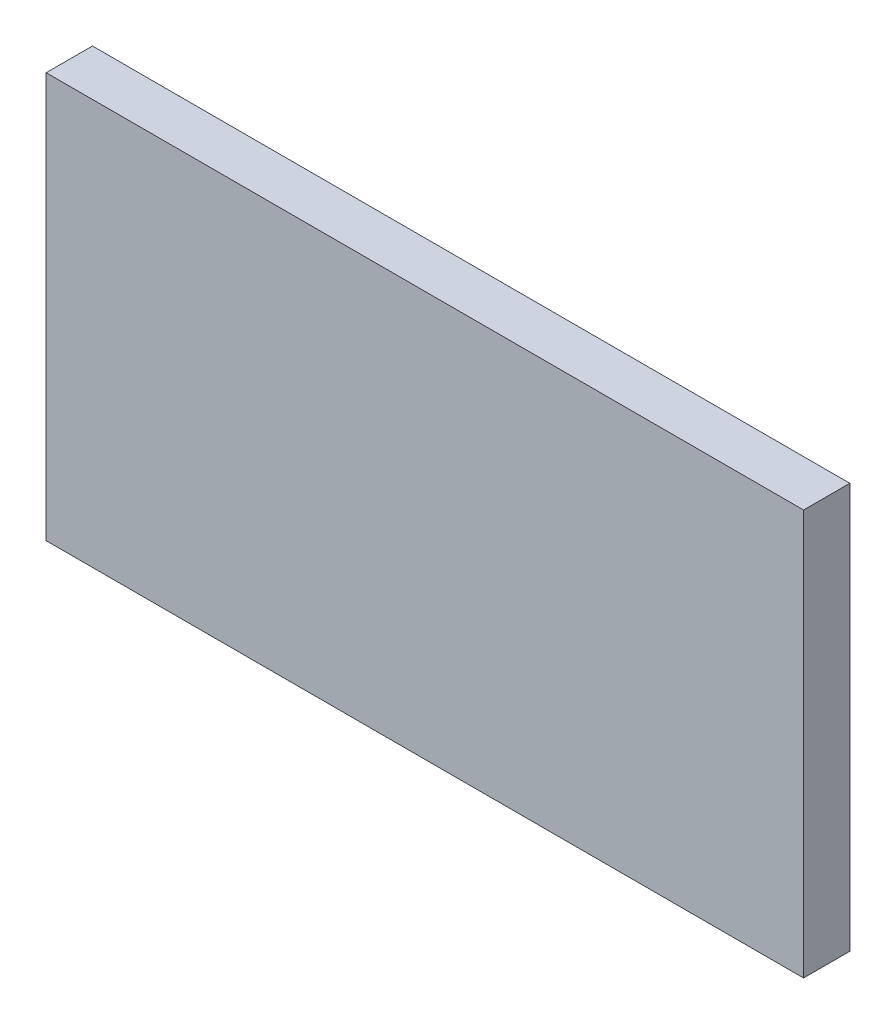
ISO-10303-21;
HEADER;
FILE_DESCRIPTION(('STEP AP214'),'2;1');
FILE_NAME('part.step','',(''),(''),'','','');
FILE_SCHEMA(('AUTOMOTIVE_DESIGN { 1 0 10303 214 1 1 1 1 }'));
ENDSEC;
DATA;
#1=APPLICATION_CONTEXT('core data for automotive mechanical design processes');
#2=APPLICATION_PROTOCOL_DEFINITION('international standard','automotive_design',2000,#1);
#3=PRODUCT_CONTEXT('',#1,'mechanical');
#4=PRODUCT('Part','Part','',(#3));
#5=PRODUCT_RELATED_PRODUCT_CATEGORY('part','',(#4));
#6=PRODUCT_DEFINITION_FORMATION('','',#4);
#7=PRODUCT_DEFINITION_CONTEXT('part definition',#1,'design');
#8=PRODUCT_DEFINITION('design','',#6,#7);
#9=PRODUCT_DEFINITION_SHAPE('','',#8);
#10=(LENGTH_UNIT() NAMED_UNIT(*) SI_UNIT(.MILLI.,.METRE.));
#11=(NAMED_UNIT(*) PLANE_ANGLE_UNIT() SI_UNIT($,.RADIAN.));
#12=(NAMED_UNIT(*) SI_UNIT($,.STERADIAN.) SOLID_ANGLE_UNIT());
#13=UNCERTAINTY_MEASURE_WITH_UNIT(LENGTH_MEASURE(1.E-05),#10,'distance_accuracy_value','');
#14=(GEOMETRIC_REPRESENTATION_CONTEXT(3) GLOBAL_UNCERTAINTY_ASSIGNED_CONTEXT((#13)) GLOBAL_UNIT_ASSIGNED_CONTEXT((#10,
#11,#12)) REPRESENTATION_CONTEXT('',''));
#15=CARTESIAN_POINT('',(0.,0.,0.));
#16=DIRECTION('',(0.,0.,1.));
#17=DIRECTION('',(1.,0.,0.));
#18=AXIS2_PLACEMENT_3D('',#15,#16,#17);
#19=CARTESIAN_POINT('',(0.,-86.1187703250195,-18.542));
#20=DIRECTION('',(0.,1.,0.));
#21=DIRECTION('',(0.,0.,1.));
#22=AXIS2_PLACEMENT_3D('',#19,#20,#21);
#23=PLANE('',#22);
#24=DIRECTION('',(-1.,0.,0.));
#25=VECTOR('',#24,1.);
#26=CARTESIAN_POINT('',(0.,-86.1187703250195,0.));
#27=LINE('',#26,#25);
#28=CARTESIAN_POINT('',(152.708767399581,-86.1187703250195,0.));
#29=VERTEX_POINT('',#28);
#30=CARTESIAN_POINT('',(-150.918286630046,-86.1187703250195,0.));
#31=VERTEX_POINT('',#30);
#32=EDGE_CURVE('E105',#29,#31,#27,.T.);
#33=ORIENTED_EDGE('',*,*,#32,.T.);
#34=DIRECTION('',(0.,0.,1.));
#35=VECTOR('',#34,1.);
#36=CARTESIAN_POINT('',(-150.918286630046,-86.1187703250195,-18.542));
#37=LINE('',#36,#35);
#38=CARTESIAN_POINT('',(-150.918286630046,-86.1187703250195,-18.542));
#39=VERTEX_POINT('',#38);
#40=EDGE_CURVE('E11',#39,#31,#37,.T.);
#41=ORIENTED_EDGE('',*,*,#40,.F.);
#42=DIRECTION('',(-1.,0.,0.));
#43=VECTOR('',#42,1.);
#44=CARTESIAN_POINT('',(0.,-86.1187703250195,-18.542));
#45=LINE('',#44,#43);
#46=CARTESIAN_POINT('',(152.708767399581,-86.1187703250195,-18.542));
#47=VERTEX_POINT('',#46);
#48=EDGE_CURVE('E100',#47,#39,#45,.T.);
#49=ORIENTED_EDGE('',*,*,#48,.F.);
#50=DIRECTION('',(0.,0.,1.));
#51=VECTOR('',#50,1.);
#52=CARTESIAN_POINT('',(152.708767399581,-86.1187703250195,-18.542));
#53=LINE('',#52,#51);
#54=EDGE_CURVE('E44',#47,#29,#53,.T.);
#55=ORIENTED_EDGE('',*,*,#54,.T.);
#56=EDGE_LOOP('',(#33,#41,#49,#55));
#57=FACE_BOUND('',#56,.T.);
#58=ADVANCED_FACE('F41',(#57),#23,.F.);
#59=CARTESIAN_POINT('',(-150.918286630046,0.,-18.542));
#60=DIRECTION('',(1.,0.,0.));
#61=DIRECTION('',(0.,0.,-1.));
#62=AXIS2_PLACEMENT_3D('',#59,#60,#61);
#63=PLANE('',#62);
#64=DIRECTION('',(0.,1.,0.));
#65=VECTOR('',#64,1.);
#66=CARTESIAN_POINT('',(-150.918286630046,0.,0.));
#67=LINE('',#66,#65);
#68=CARTESIAN_POINT('',(-150.918286630046,76.3620465381781,0.));
#69=VERTEX_POINT('',#68);
#70=EDGE_CURVE('E80',#31,#69,#67,.T.);
#71=ORIENTED_EDGE('',*,*,#70,.T.);
#72=DIRECTION('',(0.,0.,1.));
#73=VECTOR('',#72,1.);
#74=CARTESIAN_POINT('',(-150.918286630046,76.3620465381781,-18.542));
#75=LINE('',#74,#73);
#76=CARTESIAN_POINT('',(-150.918286630046,76.3620465381781,-18.542));
#77=VERTEX_POINT('',#76);
#78=EDGE_CURVE('E50',#77,#69,#75,.T.);
#79=ORIENTED_EDGE('',*,*,#78,.F.);
#80=DIRECTION('',(0.,1.,0.));
#81=VECTOR('',#80,1.);
#82=CARTESIAN_POINT('',(-150.918286630046,0.,-18.542));
#83=LINE('',#82,#81);
#84=EDGE_CURVE('E58',#39,#77,#83,.T.);
#85=ORIENTED_EDGE('',*,*,#84,.F.);
#86=ORIENTED_EDGE('',*,*,#40,.T.);
#87=EDGE_LOOP('',(#71,#79,#85,#86));
#88=FACE_BOUND('',#87,.T.);
#89=ADVANCED_FACE('F112',(#88),#63,.F.);
#90=CARTESIAN_POINT('',(0.,76.3620465381781,-18.542));
#91=DIRECTION('',(0.,1.,0.));
#92=DIRECTION('',(0.,0.,1.));
#93=AXIS2_PLACEMENT_3D('',#90,#91,#92);
#94=PLANE('',#93);
#95=DIRECTION('',(-1.,0.,0.));
#96=VECTOR('',#95,1.);
#97=CARTESIAN_POINT('',(0.,76.3620465381781,0.));
#98=LINE('',#97,#96);
#99=CARTESIAN_POINT('',(152.708767399581,76.3620465381781,0.));
#100=VERTEX_POINT('',#99);
#101=EDGE_CURVE('E92',#100,#69,#98,.T.);
#102=ORIENTED_EDGE('',*,*,#101,.F.);
#103=DIRECTION('',(0.,0.,1.));
#104=VECTOR('',#103,1.);
#105=CARTESIAN_POINT('',(152.708767399581,76.3620465381781,-18.542));
#106=LINE('',#105,#104);
#107=CARTESIAN_POINT('',(152.708767399581,76.3620465381781,-18.542));
#108=VERTEX_POINT('',#107);
#109=EDGE_CURVE('E88',#108,#100,#106,.T.);
#110=ORIENTED_EDGE('',*,*,#109,.F.);
#111=DIRECTION('',(-1.,0.,0.));
#112=VECTOR('',#111,1.);
#113=CARTESIAN_POINT('',(0.,76.3620465381781,-18.542));
#114=LINE('',#113,#112);
#115=EDGE_CURVE('E91',#108,#77,#114,.T.);
#116=ORIENTED_EDGE('',*,*,#115,.T.);
#117=ORIENTED_EDGE('',*,*,#78,.T.);
#118=EDGE_LOOP('',(#102,#110,#116,#117));
#119=FACE_BOUND('',#118,.T.);
#120=ADVANCED_FACE('F90',(#119),#94,.T.);
#121=CARTESIAN_POINT('',(152.708767399581,0.,-18.542));
#122=DIRECTION('',(1.,0.,0.));
#123=DIRECTION('',(0.,0.,-1.));
#124=AXIS2_PLACEMENT_3D('',#121,#122,#123);
#125=PLANE('',#124);
#126=DIRECTION('',(0.,1.,0.));
#127=VECTOR('',#126,1.);
#128=CARTESIAN_POINT('',(152.708767399581,0.,0.));
#129=LINE('',#128,#127);
#130=EDGE_CURVE('E108',#29,#100,#129,.T.);
#131=ORIENTED_EDGE('',*,*,#130,.F.);
#132=ORIENTED_EDGE('',*,*,#54,.F.);
#133=DIRECTION('',(0.,1.,0.));
#134=VECTOR('',#133,1.);
#135=CARTESIAN_POINT('',(152.708767399581,0.,-18.542));
#136=LINE('',#135,#134);
#137=EDGE_CURVE('E97',#47,#108,#136,.T.);
#138=ORIENTED_EDGE('',*,*,#137,.T.);
#139=ORIENTED_EDGE('',*,*,#109,.T.);
#140=EDGE_LOOP('',(#131,#132,#138,#139));
#141=FACE_BOUND('',#140,.T.);
#142=ADVANCED_FACE('F99',(#141),#125,.T.);
#143=CARTESIAN_POINT('',(0.,0.,-18.542));
#144=DIRECTION('',(0.,0.,1.));
#145=DIRECTION('',(1.,0.,0.));
#146=AXIS2_PLACEMENT_3D('',#143,#144,#145);
#147=PLANE('',#146);
#148=ORIENTED_EDGE('',*,*,#48,.T.);
#149=ORIENTED_EDGE('',*,*,#84,.T.);
#150=ORIENTED_EDGE('',*,*,#115,.F.);
#151=ORIENTED_EDGE('',*,*,#137,.F.);
#152=EDGE_LOOP('',(#148,#149,#150,#151));
#153=FACE_BOUND('',#152,.T.);
#154=ADVANCED_FACE('F96',(#153),#147,.F.);
#155=CARTESIAN_POINT('',(0.,0.,0.));
#156=DIRECTION('',(0.,0.,1.));
#157=DIRECTION('',(1.,0.,0.));
#158=AXIS2_PLACEMENT_3D('',#155,#156,#157);
#159=PLANE('',#158);
#160=ORIENTED_EDGE('',*,*,#32,.F.);
#161=ORIENTED_EDGE('',*,*,#130,.T.);
#162=ORIENTED_EDGE('',*,*,#101,.T.);
#163=ORIENTED_EDGE('',*,*,#70,.F.);
#164=EDGE_LOOP('',(#160,#161,#162,#163));
#165=FACE_BOUND('',#164,.T.);
#166=ADVANCED_FACE('F114',(#165),#159,.T.);
#167=CLOSED_SHELL('',(#58,#89,#120,#142,#154,#166));
#168=MANIFOLD_SOLID_BREP('B2',#167);
#169=ADVANCED_BREP_SHAPE_REPRESENTATION('',(#18,#168),#14);
#170=SHAPE_DEFINITION_REPRESENTATION(#9,#169);
ENDSEC;
END-ISO-10303-21;
